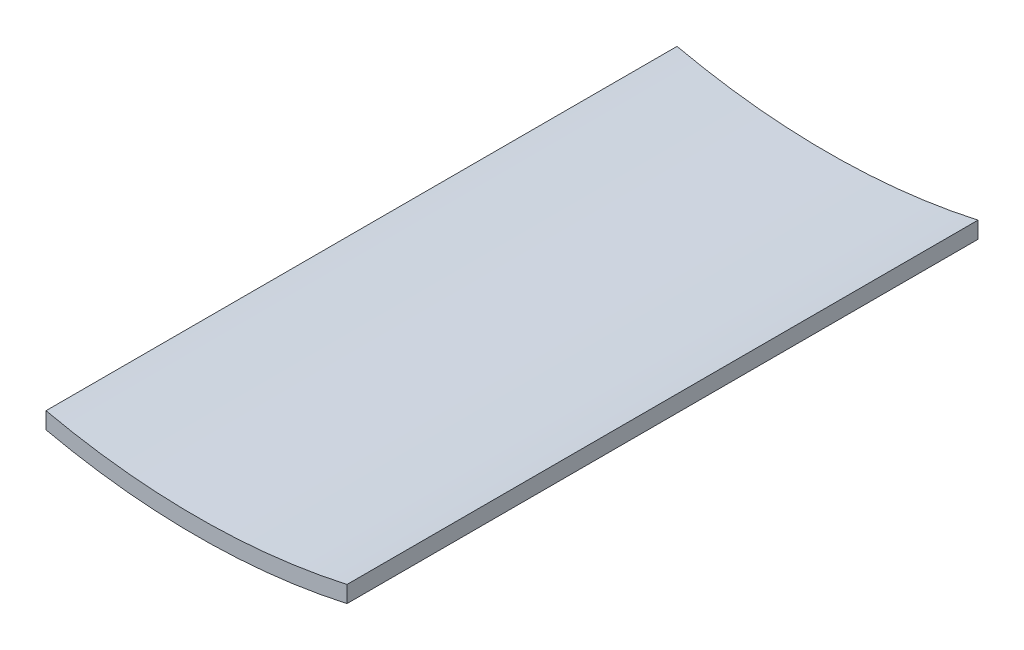
ISO-10303-21;
HEADER;
FILE_DESCRIPTION(('STEP AP214'),'2;1');
FILE_NAME('part.step','',(''),(''),'','','');
FILE_SCHEMA(('AUTOMOTIVE_DESIGN { 1 0 10303 214 1 1 1 1 }'));
ENDSEC;
DATA;
#1=APPLICATION_CONTEXT('core data for automotive mechanical design processes');
#2=APPLICATION_PROTOCOL_DEFINITION('international standard','automotive_design',2000,#1);
#3=PRODUCT_CONTEXT('',#1,'mechanical');
#4=PRODUCT('Part','Part','',(#3));
#5=PRODUCT_RELATED_PRODUCT_CATEGORY('part','',(#4));
#6=PRODUCT_DEFINITION_FORMATION('','',#4);
#7=PRODUCT_DEFINITION_CONTEXT('part definition',#1,'design');
#8=PRODUCT_DEFINITION('design','',#6,#7);
#9=PRODUCT_DEFINITION_SHAPE('','',#8);
#10=(LENGTH_UNIT() NAMED_UNIT(*) SI_UNIT(.MILLI.,.METRE.));
#11=(NAMED_UNIT(*) PLANE_ANGLE_UNIT() SI_UNIT($,.RADIAN.));
#12=(NAMED_UNIT(*) SI_UNIT($,.STERADIAN.) SOLID_ANGLE_UNIT());
#13=UNCERTAINTY_MEASURE_WITH_UNIT(LENGTH_MEASURE(1.E-05),#10,'distance_accuracy_value','');
#14=(GEOMETRIC_REPRESENTATION_CONTEXT(3) GLOBAL_UNCERTAINTY_ASSIGNED_CONTEXT((#13)) GLOBAL_UNIT_ASSIGNED_CONTEXT((#10,
#11,#12)) REPRESENTATION_CONTEXT('',''));
#15=CARTESIAN_POINT('',(0.,0.,0.));
#16=DIRECTION('',(0.,0.,1.));
#17=DIRECTION('',(1.,0.,0.));
#18=AXIS2_PLACEMENT_3D('',#15,#16,#17);
#19=CARTESIAN_POINT('',(115.09375,502.468566815301,482.6));
#20=DIRECTION('',(0.,0.,-1.));
#21=DIRECTION('',(-1.,0.,0.));
#22=AXIS2_PLACEMENT_3D('',#19,#20,#21);
#23=CYLINDRICAL_SURFACE('',#22,527.868566523518);
#24=CARTESIAN_POINT('',(115.09375,502.468566815301,0.));
#25=DIRECTION('',(0.,0.,1.));
#26=DIRECTION('',(1.,0.,0.));
#27=AXIS2_PLACEMENT_3D('',#24,#25,#26);
#28=CIRCLE('',#27,527.868566523518);
#29=CARTESIAN_POINT('',(230.1875,-12.7,0.));
#30=VERTEX_POINT('',#29);
#31=CARTESIAN_POINT('',(1.33025439009923E-13,-12.7,0.));
#32=VERTEX_POINT('',#31);
#33=EDGE_CURVE('E97',#30,#32,#28,.F.);
#34=ORIENTED_EDGE('',*,*,#33,.F.);
#35=DIRECTION('',(0.,0.,-1.));
#36=VECTOR('',#35,1.);
#37=CARTESIAN_POINT('',(230.1875,-12.7,482.6));
#38=LINE('',#37,#36);
#39=CARTESIAN_POINT('',(230.1875,-12.7,482.6));
#40=VERTEX_POINT('',#39);
#41=EDGE_CURVE('E11',#40,#30,#38,.T.);
#42=ORIENTED_EDGE('',*,*,#41,.F.);
#43=CARTESIAN_POINT('',(115.09375,502.468566815301,482.6));
#44=DIRECTION('',(0.,0.,1.));
#45=DIRECTION('',(1.,0.,0.));
#46=AXIS2_PLACEMENT_3D('',#43,#44,#45);
#47=CIRCLE('',#46,527.868566523518);
#48=CARTESIAN_POINT('',(1.33025439009923E-13,-12.7,482.6));
#49=VERTEX_POINT('',#48);
#50=EDGE_CURVE('E91',#40,#49,#47,.F.);
#51=ORIENTED_EDGE('',*,*,#50,.T.);
#52=DIRECTION('',(0.,0.,-1.));
#53=VECTOR('',#52,1.);
#54=CARTESIAN_POINT('',(1.33025439009923E-13,-12.7,482.6));
#55=LINE('',#54,#53);
#56=EDGE_CURVE('E72',#49,#32,#55,.T.);
#57=ORIENTED_EDGE('',*,*,#56,.T.);
#58=EDGE_LOOP('',(#34,#42,#51,#57));
#59=FACE_BOUND('',#58,.T.);
#60=ADVANCED_FACE('F34',(#59),#23,.T.);
#61=CARTESIAN_POINT('',(230.1875,2.51534904016637E-12,482.6));
#62=DIRECTION('',(1.,0.,0.));
#63=DIRECTION('',(0.,1.,0.));
#64=AXIS2_PLACEMENT_3D('',#61,#62,#63);
#65=PLANE('',#64);
#66=DIRECTION('',(0.,-1.,0.));
#67=VECTOR('',#66,1.);
#68=CARTESIAN_POINT('',(230.1875,2.51534904016637E-12,0.));
#69=LINE('',#68,#67);
#70=CARTESIAN_POINT('',(230.1875,0.,0.));
#71=VERTEX_POINT('',#70);
#72=EDGE_CURVE('E85',#71,#30,#69,.T.);
#73=ORIENTED_EDGE('',*,*,#72,.F.);
#74=DIRECTION('',(0.,0.,-1.));
#75=VECTOR('',#74,1.);
#76=CARTESIAN_POINT('',(230.1875,0.,482.6));
#77=LINE('',#76,#75);
#78=CARTESIAN_POINT('',(230.1875,0.,482.6));
#79=VERTEX_POINT('',#78);
#80=EDGE_CURVE('E42',#79,#71,#77,.T.);
#81=ORIENTED_EDGE('',*,*,#80,.F.);
#82=DIRECTION('',(0.,-1.,0.));
#83=VECTOR('',#82,1.);
#84=CARTESIAN_POINT('',(230.1875,2.51534904016637E-12,482.6));
#85=LINE('',#84,#83);
#86=EDGE_CURVE('E83',#79,#40,#85,.T.);
#87=ORIENTED_EDGE('',*,*,#86,.T.);
#88=ORIENTED_EDGE('',*,*,#41,.T.);
#89=EDGE_LOOP('',(#73,#81,#87,#88));
#90=FACE_BOUND('',#89,.T.);
#91=ADVANCED_FACE('F81',(#90),#65,.T.);
#92=CARTESIAN_POINT('',(115.09375,515.168566815301,482.6));
#93=DIRECTION('',(0.,0.,-1.));
#94=DIRECTION('',(-1.,0.,0.));
#95=AXIS2_PLACEMENT_3D('',#92,#93,#94);
#96=CYLINDRICAL_SURFACE('',#95,527.868566523518);
#97=CARTESIAN_POINT('',(115.09375,515.168566815301,0.));
#98=DIRECTION('',(0.,0.,1.));
#99=DIRECTION('',(1.,0.,0.));
#100=AXIS2_PLACEMENT_3D('',#97,#98,#99);
#101=CIRCLE('',#100,527.868566523518);
#102=CARTESIAN_POINT('',(0.,0.,0.));
#103=VERTEX_POINT('',#102);
#104=EDGE_CURVE('E65',#71,#103,#101,.F.);
#105=ORIENTED_EDGE('',*,*,#104,.T.);
#106=DIRECTION('',(0.,0.,-1.));
#107=VECTOR('',#106,1.);
#108=CARTESIAN_POINT('',(0.,0.,482.6));
#109=LINE('',#108,#107);
#110=CARTESIAN_POINT('',(0.,0.,482.6));
#111=VERTEX_POINT('',#110);
#112=EDGE_CURVE('E86',#111,#103,#109,.T.);
#113=ORIENTED_EDGE('',*,*,#112,.F.);
#114=CARTESIAN_POINT('',(115.09375,515.168566815301,482.6));
#115=DIRECTION('',(0.,0.,1.));
#116=DIRECTION('',(1.,0.,0.));
#117=AXIS2_PLACEMENT_3D('',#114,#115,#116);
#118=CIRCLE('',#117,527.868566523518);
#119=EDGE_CURVE('E87',#79,#111,#118,.F.);
#120=ORIENTED_EDGE('',*,*,#119,.F.);
#121=ORIENTED_EDGE('',*,*,#80,.T.);
#122=EDGE_LOOP('',(#105,#113,#120,#121));
#123=FACE_BOUND('',#122,.T.);
#124=ADVANCED_FACE('F88',(#123),#96,.F.);
#125=CARTESIAN_POINT('',(0.,0.,482.6));
#126=DIRECTION('',(1.,0.,0.));
#127=DIRECTION('',(0.,1.,0.));
#128=AXIS2_PLACEMENT_3D('',#125,#126,#127);
#129=PLANE('',#128);
#130=DIRECTION('',(0.,-1.,0.));
#131=VECTOR('',#130,1.);
#132=CARTESIAN_POINT('',(0.,0.,0.));
#133=LINE('',#132,#131);
#134=EDGE_CURVE('E93',#103,#32,#133,.T.);
#135=ORIENTED_EDGE('',*,*,#134,.T.);
#136=ORIENTED_EDGE('',*,*,#56,.F.);
#137=DIRECTION('',(0.,-1.,0.));
#138=VECTOR('',#137,1.);
#139=CARTESIAN_POINT('',(0.,0.,482.6));
#140=LINE('',#139,#138);
#141=EDGE_CURVE('E50',#111,#49,#140,.T.);
#142=ORIENTED_EDGE('',*,*,#141,.F.);
#143=ORIENTED_EDGE('',*,*,#112,.T.);
#144=EDGE_LOOP('',(#135,#136,#142,#143));
#145=FACE_BOUND('',#144,.T.);
#146=ADVANCED_FACE('F106',(#145),#129,.F.);
#147=CARTESIAN_POINT('',(0.,0.,482.6));
#148=DIRECTION('',(0.,0.,1.));
#149=DIRECTION('',(1.,0.,0.));
#150=AXIS2_PLACEMENT_3D('',#147,#148,#149);
#151=PLANE('',#150);
#152=ORIENTED_EDGE('',*,*,#50,.F.);
#153=ORIENTED_EDGE('',*,*,#86,.F.);
#154=ORIENTED_EDGE('',*,*,#119,.T.);
#155=ORIENTED_EDGE('',*,*,#141,.T.);
#156=EDGE_LOOP('',(#152,#153,#154,#155));
#157=FACE_BOUND('',#156,.T.);
#158=ADVANCED_FACE('F90',(#157),#151,.T.);
#159=CARTESIAN_POINT('',(0.,0.,0.));
#160=DIRECTION('',(0.,0.,1.));
#161=DIRECTION('',(1.,0.,0.));
#162=AXIS2_PLACEMENT_3D('',#159,#160,#161);
#163=PLANE('',#162);
#164=ORIENTED_EDGE('',*,*,#33,.T.);
#165=ORIENTED_EDGE('',*,*,#134,.F.);
#166=ORIENTED_EDGE('',*,*,#104,.F.);
#167=ORIENTED_EDGE('',*,*,#72,.T.);
#168=EDGE_LOOP('',(#164,#165,#166,#167));
#169=FACE_BOUND('',#168,.T.);
#170=ADVANCED_FACE('F108',(#169),#163,.F.);
#171=CLOSED_SHELL('',(#60,#91,#124,#146,#158,#170));
#172=MANIFOLD_SOLID_BREP('B2',#171);
#173=ADVANCED_BREP_SHAPE_REPRESENTATION('',(#18,#172),#14);
#174=SHAPE_DEFINITION_REPRESENTATION(#9,#173);
ENDSEC;
END-ISO-10303-21;
